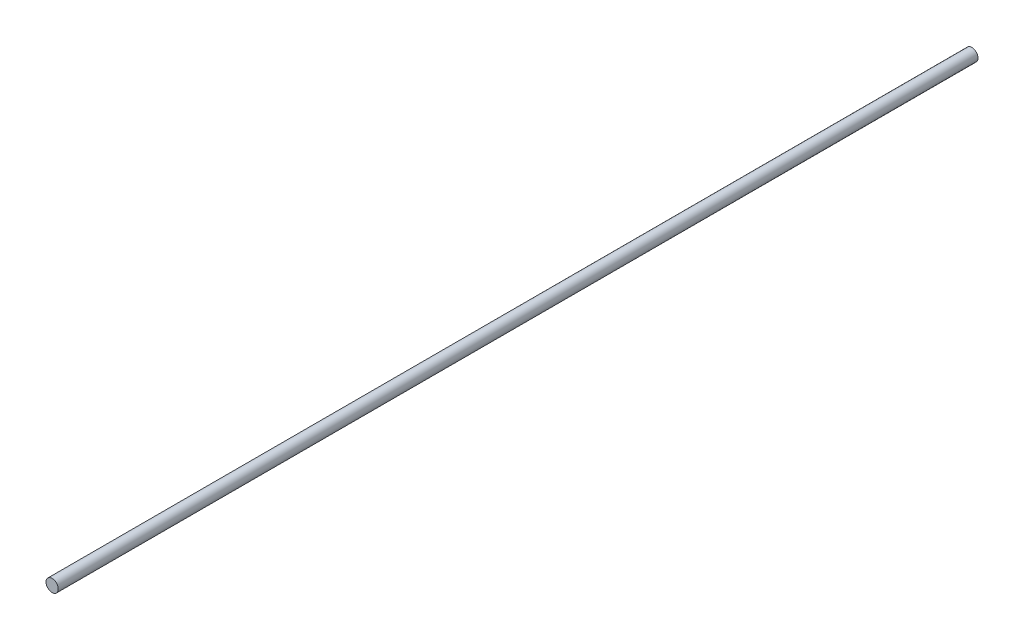
ISO-10303-21;
HEADER;
FILE_DESCRIPTION(('STEP AP214'),'2;1');
FILE_NAME('part.step','',(''),(''),'','','');
FILE_SCHEMA(('AUTOMOTIVE_DESIGN { 1 0 10303 214 1 1 1 1 }'));
ENDSEC;
DATA;
#1=APPLICATION_CONTEXT('core data for automotive mechanical design processes');
#2=APPLICATION_PROTOCOL_DEFINITION('international standard','automotive_design',2000,#1);
#3=PRODUCT_CONTEXT('',#1,'mechanical');
#4=PRODUCT('Part','Part','',(#3));
#5=PRODUCT_RELATED_PRODUCT_CATEGORY('part','',(#4));
#6=PRODUCT_DEFINITION_FORMATION('','',#4);
#7=PRODUCT_DEFINITION_CONTEXT('part definition',#1,'design');
#8=PRODUCT_DEFINITION('design','',#6,#7);
#9=PRODUCT_DEFINITION_SHAPE('','',#8);
#10=(LENGTH_UNIT() NAMED_UNIT(*) SI_UNIT(.MILLI.,.METRE.));
#11=(NAMED_UNIT(*) PLANE_ANGLE_UNIT() SI_UNIT($,.RADIAN.));
#12=(NAMED_UNIT(*) SI_UNIT($,.STERADIAN.) SOLID_ANGLE_UNIT());
#13=UNCERTAINTY_MEASURE_WITH_UNIT(LENGTH_MEASURE(1.E-05),#10,'distance_accuracy_value','');
#14=(GEOMETRIC_REPRESENTATION_CONTEXT(3) GLOBAL_UNCERTAINTY_ASSIGNED_CONTEXT((#13)) GLOBAL_UNIT_ASSIGNED_CONTEXT((#10,
#11,#12)) REPRESENTATION_CONTEXT('',''));
#15=CARTESIAN_POINT('',(0.,0.,0.));
#16=DIRECTION('',(0.,0.,1.));
#17=DIRECTION('',(1.,0.,0.));
#18=AXIS2_PLACEMENT_3D('',#15,#16,#17);
#19=CARTESIAN_POINT('',(0.,0.,119.0625));
#20=DIRECTION('',(0.,0.,-1.));
#21=DIRECTION('',(-1.,0.,0.));
#22=AXIS2_PLACEMENT_3D('',#19,#20,#21);
#23=CYLINDRICAL_SURFACE('',#22,1.5875);
#24=CARTESIAN_POINT('',(0.,0.,119.0625));
#25=DIRECTION('',(0.,0.,1.));
#26=DIRECTION('',(1.,0.,0.));
#27=AXIS2_PLACEMENT_3D('',#24,#25,#26);
#28=CIRCLE('',#27,1.5875);
#29=CARTESIAN_POINT('',(1.5875,0.,119.0625));
#30=VERTEX_POINT('',#29);
#31=EDGE_CURVE('E10',#30,#30,#28,.T.);
#32=ORIENTED_EDGE('',*,*,#31,.F.);
#33=EDGE_LOOP('',(#32));
#34=FACE_BOUND('',#33,.T.);
#35=CARTESIAN_POINT('',(0.,0.,-119.0625));
#36=DIRECTION('',(0.,0.,1.));
#37=DIRECTION('',(1.,0.,0.));
#38=AXIS2_PLACEMENT_3D('',#35,#36,#37);
#39=CIRCLE('',#38,1.5875);
#40=CARTESIAN_POINT('',(1.5875,0.,-119.0625));
#41=VERTEX_POINT('',#40);
#42=EDGE_CURVE('E36',#41,#41,#39,.T.);
#43=ORIENTED_EDGE('',*,*,#42,.T.);
#44=EDGE_LOOP('',(#43));
#45=FACE_BOUND('',#44,.T.);
#46=ADVANCED_FACE('F33',(#34,#45),#23,.T.);
#47=CARTESIAN_POINT('',(0.,0.,119.0625));
#48=DIRECTION('',(0.,0.,1.));
#49=DIRECTION('',(1.,0.,0.));
#50=AXIS2_PLACEMENT_3D('',#47,#48,#49);
#51=PLANE('',#50);
#52=ORIENTED_EDGE('',*,*,#31,.T.);
#53=EDGE_LOOP('',(#52));
#54=FACE_BOUND('',#53,.T.);
#55=ADVANCED_FACE('F48',(#54),#51,.T.);
#56=CARTESIAN_POINT('',(0.,0.,-119.0625));
#57=DIRECTION('',(0.,0.,1.));
#58=DIRECTION('',(1.,0.,0.));
#59=AXIS2_PLACEMENT_3D('',#56,#57,#58);
#60=PLANE('',#59);
#61=ORIENTED_EDGE('',*,*,#42,.F.);
#62=EDGE_LOOP('',(#61));
#63=FACE_BOUND('',#62,.T.);
#64=ADVANCED_FACE('F46',(#63),#60,.F.);
#65=CLOSED_SHELL('',(#46,#55,#64));
#66=MANIFOLD_SOLID_BREP('B2',#65);
#67=ADVANCED_BREP_SHAPE_REPRESENTATION('',(#18,#66),#14);
#68=SHAPE_DEFINITION_REPRESENTATION(#9,#67);
ENDSEC;
END-ISO-10303-21;
